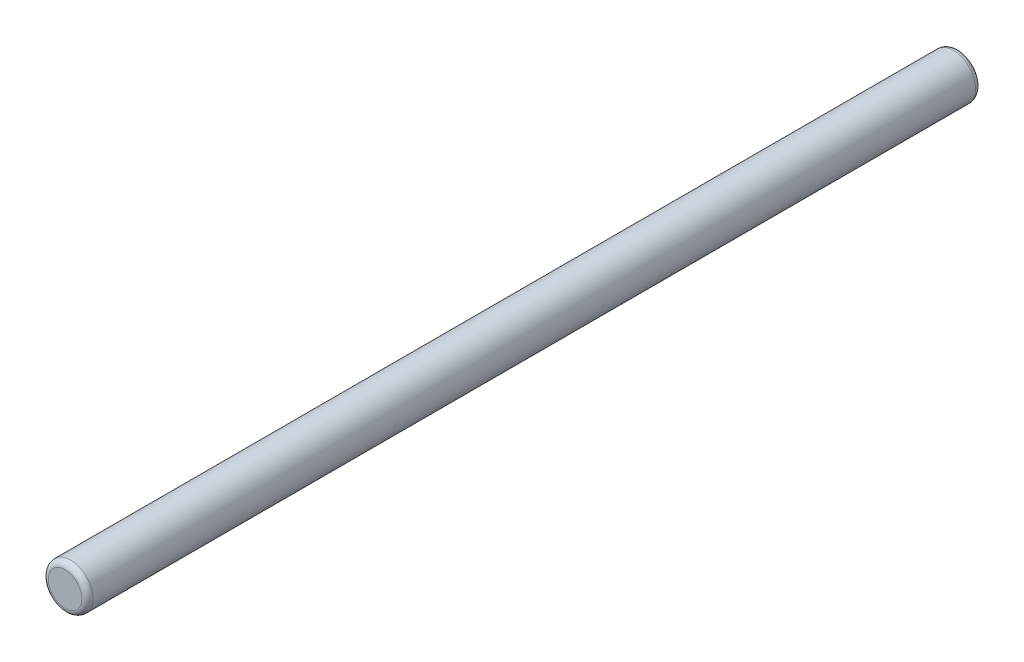
ISO-10303-21;
HEADER;
FILE_DESCRIPTION(('STEP AP214'),'2;1');
FILE_NAME('part.step','',(''),(''),'','','');
FILE_SCHEMA(('AUTOMOTIVE_DESIGN { 1 0 10303 214 1 1 1 1 }'));
ENDSEC;
DATA;
#1=APPLICATION_CONTEXT('core data for automotive mechanical design processes');
#2=APPLICATION_PROTOCOL_DEFINITION('international standard','automotive_design',2000,#1);
#3=PRODUCT_CONTEXT('',#1,'mechanical');
#4=PRODUCT('Part','Part','',(#3));
#5=PRODUCT_RELATED_PRODUCT_CATEGORY('part','',(#4));
#6=PRODUCT_DEFINITION_FORMATION('','',#4);
#7=PRODUCT_DEFINITION_CONTEXT('part definition',#1,'design');
#8=PRODUCT_DEFINITION('design','',#6,#7);
#9=PRODUCT_DEFINITION_SHAPE('','',#8);
#10=(LENGTH_UNIT() NAMED_UNIT(*) SI_UNIT(.MILLI.,.METRE.));
#11=(NAMED_UNIT(*) PLANE_ANGLE_UNIT() SI_UNIT($,.RADIAN.));
#12=(NAMED_UNIT(*) SI_UNIT($,.STERADIAN.) SOLID_ANGLE_UNIT());
#13=UNCERTAINTY_MEASURE_WITH_UNIT(LENGTH_MEASURE(1.E-05),#10,'distance_accuracy_value','');
#14=(GEOMETRIC_REPRESENTATION_CONTEXT(3) GLOBAL_UNCERTAINTY_ASSIGNED_CONTEXT((#13)) GLOBAL_UNIT_ASSIGNED_CONTEXT((#10,
#11,#12)) REPRESENTATION_CONTEXT('',''));
#15=CARTESIAN_POINT('',(0.,0.,0.));
#16=DIRECTION('',(0.,0.,1.));
#17=DIRECTION('',(1.,0.,0.));
#18=AXIS2_PLACEMENT_3D('',#15,#16,#17);
#19=CARTESIAN_POINT('',(0.,0.,48.));
#20=DIRECTION('',(0.,0.,-1.));
#21=DIRECTION('',(-1.,0.,0.));
#22=AXIS2_PLACEMENT_3D('',#19,#20,#21);
#23=CYLINDRICAL_SURFACE('',#22,1.2);
#24=CARTESIAN_POINT('',(0.,0.,0.300000000000002));
#25=DIRECTION('',(0.,0.,1.));
#26=DIRECTION('',(1.,0.,0.));
#27=AXIS2_PLACEMENT_3D('',#24,#25,#26);
#28=CIRCLE('',#27,1.2);
#29=CARTESIAN_POINT('',(1.2,0.,0.300000000000002));
#30=VERTEX_POINT('',#29);
#31=EDGE_CURVE('E42',#30,#30,#28,.T.);
#32=ORIENTED_EDGE('',*,*,#31,.T.);
#33=EDGE_LOOP('',(#32));
#34=FACE_BOUND('',#33,.T.);
#35=CARTESIAN_POINT('',(0.,0.,47.7));
#36=DIRECTION('',(0.,0.,1.));
#37=DIRECTION('',(1.,0.,0.));
#38=AXIS2_PLACEMENT_3D('',#35,#36,#37);
#39=CIRCLE('',#38,1.2);
#40=CARTESIAN_POINT('',(1.2,0.,47.7));
#41=VERTEX_POINT('',#40);
#42=EDGE_CURVE('E46',#41,#41,#39,.F.);
#43=ORIENTED_EDGE('',*,*,#42,.T.);
#44=EDGE_LOOP('',(#43));
#45=FACE_BOUND('',#44,.T.);
#46=ADVANCED_FACE('F31',(#34,#45),#23,.T.);
#47=CARTESIAN_POINT('',(0.,0.,48.));
#48=DIRECTION('',(0.,0.,1.));
#49=DIRECTION('',(1.,0.,0.));
#50=AXIS2_PLACEMENT_3D('',#47,#48,#49);
#51=PLANE('',#50);
#52=CARTESIAN_POINT('',(0.,0.,48.));
#53=DIRECTION('',(0.,0.,1.));
#54=DIRECTION('',(1.,0.,0.));
#55=AXIS2_PLACEMENT_3D('',#52,#53,#54);
#56=CIRCLE('',#55,0.9);
#57=CARTESIAN_POINT('',(0.9,0.,48.));
#58=VERTEX_POINT('',#57);
#59=EDGE_CURVE('E10',#58,#58,#56,.T.);
#60=ORIENTED_EDGE('',*,*,#59,.T.);
#61=EDGE_LOOP('',(#60));
#62=FACE_BOUND('',#61,.T.);
#63=ADVANCED_FACE('F62',(#62),#51,.T.);
#64=CARTESIAN_POINT('',(0.,0.,0.));
#65=DIRECTION('',(0.,0.,1.));
#66=DIRECTION('',(1.,0.,0.));
#67=AXIS2_PLACEMENT_3D('',#64,#65,#66);
#68=PLANE('',#67);
#69=CARTESIAN_POINT('',(0.,0.,0.));
#70=DIRECTION('',(0.,0.,1.));
#71=DIRECTION('',(1.,0.,0.));
#72=AXIS2_PLACEMENT_3D('',#69,#70,#71);
#73=CIRCLE('',#72,0.9);
#74=CARTESIAN_POINT('',(0.9,0.,0.));
#75=VERTEX_POINT('',#74);
#76=EDGE_CURVE('E38',#75,#75,#73,.F.);
#77=ORIENTED_EDGE('',*,*,#76,.T.);
#78=EDGE_LOOP('',(#77));
#79=FACE_BOUND('',#78,.T.);
#80=ADVANCED_FACE('F59',(#79),#68,.F.);
#81=CARTESIAN_POINT('',(0.,0.,0.300000000000002));
#82=DIRECTION('',(0.,0.,1.));
#83=DIRECTION('',(1.,0.,0.));
#84=AXIS2_PLACEMENT_3D('',#81,#82,#83);
#85=TOROIDAL_SURFACE('',#84,0.9,0.3);
#86=ORIENTED_EDGE('',*,*,#76,.F.);
#87=EDGE_LOOP('',(#86));
#88=FACE_BOUND('',#87,.T.);
#89=ORIENTED_EDGE('',*,*,#31,.F.);
#90=EDGE_LOOP('',(#89));
#91=FACE_BOUND('',#90,.T.);
#92=ADVANCED_FACE('F55',(#88,#91),#85,.T.);
#93=CARTESIAN_POINT('',(0.,0.,47.7));
#94=DIRECTION('',(0.,0.,1.));
#95=DIRECTION('',(1.,0.,0.));
#96=AXIS2_PLACEMENT_3D('',#93,#94,#95);
#97=TOROIDAL_SURFACE('',#96,0.9,0.3);
#98=ORIENTED_EDGE('',*,*,#42,.F.);
#99=EDGE_LOOP('',(#98));
#100=FACE_BOUND('',#99,.T.);
#101=ORIENTED_EDGE('',*,*,#59,.F.);
#102=EDGE_LOOP('',(#101));
#103=FACE_BOUND('',#102,.T.);
#104=ADVANCED_FACE('F33',(#100,#103),#97,.T.);
#105=CLOSED_SHELL('',(#46,#63,#80,#92,#104));
#106=MANIFOLD_SOLID_BREP('B2',#105);
#107=ADVANCED_BREP_SHAPE_REPRESENTATION('',(#18,#106),#14);
#108=SHAPE_DEFINITION_REPRESENTATION(#9,#107);
ENDSEC;
END-ISO-10303-21;
